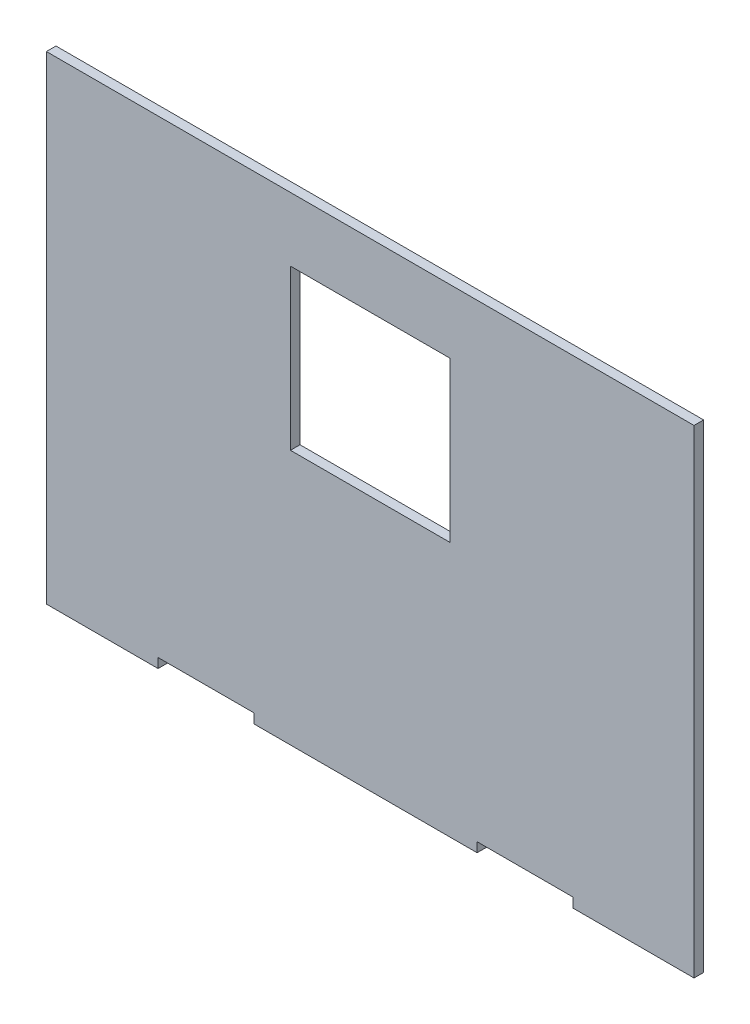
ISO-10303-21;
HEADER;
FILE_DESCRIPTION(('STEP AP214'),'2;1');
FILE_NAME('part.step','',(''),(''),'','','');
FILE_SCHEMA(('AUTOMOTIVE_DESIGN { 1 0 10303 214 1 1 1 1 }'));
ENDSEC;
DATA;
#1=APPLICATION_CONTEXT('core data for automotive mechanical design processes');
#2=APPLICATION_PROTOCOL_DEFINITION('international standard','automotive_design',2000,#1);
#3=PRODUCT_CONTEXT('',#1,'mechanical');
#4=PRODUCT('Part','Part','',(#3));
#5=PRODUCT_RELATED_PRODUCT_CATEGORY('part','',(#4));
#6=PRODUCT_DEFINITION_FORMATION('','',#4);
#7=PRODUCT_DEFINITION_CONTEXT('part definition',#1,'design');
#8=PRODUCT_DEFINITION('design','',#6,#7);
#9=PRODUCT_DEFINITION_SHAPE('','',#8);
#10=(LENGTH_UNIT() NAMED_UNIT(*) SI_UNIT(.MILLI.,.METRE.));
#11=(NAMED_UNIT(*) PLANE_ANGLE_UNIT() SI_UNIT($,.RADIAN.));
#12=(NAMED_UNIT(*) SI_UNIT($,.STERADIAN.) SOLID_ANGLE_UNIT());
#13=UNCERTAINTY_MEASURE_WITH_UNIT(LENGTH_MEASURE(1.E-05),#10,'distance_accuracy_value','');
#14=(GEOMETRIC_REPRESENTATION_CONTEXT(3) GLOBAL_UNCERTAINTY_ASSIGNED_CONTEXT((#13)) GLOBAL_UNIT_ASSIGNED_CONTEXT((#10,
#11,#12)) REPRESENTATION_CONTEXT('',''));
#15=CARTESIAN_POINT('',(0.,0.,0.));
#16=DIRECTION('',(0.,0.,1.));
#17=DIRECTION('',(1.,0.,0.));
#18=AXIS2_PLACEMENT_3D('',#15,#16,#17);
#19=CARTESIAN_POINT('',(-101.5,-75.,3.));
#20=DIRECTION('',(0.,1.,0.));
#21=DIRECTION('',(0.,0.,1.));
#22=AXIS2_PLACEMENT_3D('',#19,#20,#21);
#23=PLANE('',#22);
#24=DIRECTION('',(1.,0.,0.));
#25=VECTOR('',#24,1.);
#26=CARTESIAN_POINT('',(-101.5,-75.,0.));
#27=LINE('',#26,#25);
#28=CARTESIAN_POINT('',(-101.5,-75.,0.));
#29=VERTEX_POINT('',#28);
#30=CARTESIAN_POINT('',(-66.5000000000002,-75.,0.));
#31=VERTEX_POINT('',#30);
#32=EDGE_CURVE('E171',#29,#31,#27,.T.);
#33=ORIENTED_EDGE('',*,*,#32,.T.);
#34=DIRECTION('',(0.,0.,1.));
#35=VECTOR('',#34,1.);
#36=CARTESIAN_POINT('',(-66.5000000000002,-75.,-7.));
#37=LINE('',#36,#35);
#38=CARTESIAN_POINT('',(-66.5000000000002,-75.,3.));
#39=VERTEX_POINT('',#38);
#40=EDGE_CURVE('E154',#31,#39,#37,.T.);
#41=ORIENTED_EDGE('',*,*,#40,.T.);
#42=DIRECTION('',(1.,0.,0.));
#43=VECTOR('',#42,1.);
#44=CARTESIAN_POINT('',(-101.5,-75.,3.));
#45=LINE('',#44,#43);
#46=CARTESIAN_POINT('',(-101.5,-75.,3.));
#47=VERTEX_POINT('',#46);
#48=EDGE_CURVE('E169',#47,#39,#45,.T.);
#49=ORIENTED_EDGE('',*,*,#48,.F.);
#50=DIRECTION('',(0.,0.,-1.));
#51=VECTOR('',#50,1.);
#52=CARTESIAN_POINT('',(-101.5,-75.,3.));
#53=LINE('',#52,#51);
#54=EDGE_CURVE('E189',#47,#29,#53,.T.);
#55=ORIENTED_EDGE('',*,*,#54,.T.);
#56=EDGE_LOOP('',(#33,#41,#49,#55));
#57=FACE_BOUND('',#56,.T.);
#58=ADVANCED_FACE('F38',(#57),#23,.F.);
#59=CARTESIAN_POINT('',(-36.5000000000002,-75.,3.));
#60=VERTEX_POINT('',#59);
#61=CARTESIAN_POINT('',(33.4999999999998,-75.,3.));
#62=VERTEX_POINT('',#61);
#63=EDGE_CURVE('E183',#60,#62,#45,.T.);
#64=ORIENTED_EDGE('',*,*,#63,.F.);
#65=DIRECTION('',(0.,0.,1.));
#66=VECTOR('',#65,1.);
#67=CARTESIAN_POINT('',(-36.5000000000002,-75.,-7.));
#68=LINE('',#67,#66);
#69=CARTESIAN_POINT('',(-36.5000000000002,-75.,0.));
#70=VERTEX_POINT('',#69);
#71=EDGE_CURVE('E173',#70,#60,#68,.T.);
#72=ORIENTED_EDGE('',*,*,#71,.F.);
#73=CARTESIAN_POINT('',(33.4999999999998,-75.,0.));
#74=VERTEX_POINT('',#73);
#75=EDGE_CURVE('E281',#70,#74,#27,.T.);
#76=ORIENTED_EDGE('',*,*,#75,.T.);
#77=DIRECTION('',(0.,0.,1.));
#78=VECTOR('',#77,1.);
#79=CARTESIAN_POINT('',(33.4999999999998,-75.,-7.));
#80=LINE('',#79,#78);
#81=EDGE_CURVE('E163',#74,#62,#80,.T.);
#82=ORIENTED_EDGE('',*,*,#81,.T.);
#83=EDGE_LOOP('',(#64,#72,#76,#82));
#84=FACE_BOUND('',#83,.T.);
#85=ADVANCED_FACE('F353',(#84),#23,.F.);
#86=CARTESIAN_POINT('',(101.5,75.,3.));
#87=DIRECTION('',(-1.,0.,0.));
#88=DIRECTION('',(0.,-1.,0.));
#89=AXIS2_PLACEMENT_3D('',#86,#87,#88);
#90=PLANE('',#89);
#91=DIRECTION('',(0.,1.,0.));
#92=VECTOR('',#91,1.);
#93=CARTESIAN_POINT('',(101.5,75.,0.));
#94=LINE('',#93,#92);
#95=CARTESIAN_POINT('',(101.5,-75.,0.));
#96=VERTEX_POINT('',#95);
#97=CARTESIAN_POINT('',(101.5,75.,0.));
#98=VERTEX_POINT('',#97);
#99=EDGE_CURVE('E221',#96,#98,#94,.T.);
#100=ORIENTED_EDGE('',*,*,#99,.T.);
#101=DIRECTION('',(0.,0.,-1.));
#102=VECTOR('',#101,1.);
#103=CARTESIAN_POINT('',(101.5,75.,3.));
#104=LINE('',#103,#102);
#105=CARTESIAN_POINT('',(101.5,75.,3.));
#106=VERTEX_POINT('',#105);
#107=EDGE_CURVE('E312',#106,#98,#104,.T.);
#108=ORIENTED_EDGE('',*,*,#107,.F.);
#109=DIRECTION('',(0.,1.,0.));
#110=VECTOR('',#109,1.);
#111=CARTESIAN_POINT('',(101.5,75.,3.));
#112=LINE('',#111,#110);
#113=CARTESIAN_POINT('',(101.5,-75.,3.));
#114=VERTEX_POINT('',#113);
#115=EDGE_CURVE('E202',#114,#106,#112,.T.);
#116=ORIENTED_EDGE('',*,*,#115,.F.);
#117=DIRECTION('',(0.,0.,-1.));
#118=VECTOR('',#117,1.);
#119=CARTESIAN_POINT('',(101.5,-75.,3.));
#120=LINE('',#119,#118);
#121=EDGE_CURVE('E182',#114,#96,#120,.T.);
#122=ORIENTED_EDGE('',*,*,#121,.T.);
#123=EDGE_LOOP('',(#100,#108,#116,#122));
#124=FACE_BOUND('',#123,.T.);
#125=ADVANCED_FACE('F40',(#124),#90,.F.);
#126=CARTESIAN_POINT('',(-101.5,75.,3.));
#127=DIRECTION('',(0.,-1.,0.));
#128=DIRECTION('',(0.,0.,-1.));
#129=AXIS2_PLACEMENT_3D('',#126,#127,#128);
#130=PLANE('',#129);
#131=DIRECTION('',(-1.,0.,0.));
#132=VECTOR('',#131,1.);
#133=CARTESIAN_POINT('',(-101.5,75.,0.));
#134=LINE('',#133,#132);
#135=CARTESIAN_POINT('',(-101.5,75.,0.));
#136=VERTEX_POINT('',#135);
#137=EDGE_CURVE('E328',#98,#136,#134,.T.);
#138=ORIENTED_EDGE('',*,*,#137,.T.);
#139=DIRECTION('',(0.,0.,-1.));
#140=VECTOR('',#139,1.);
#141=CARTESIAN_POINT('',(-101.5,75.,3.));
#142=LINE('',#141,#140);
#143=CARTESIAN_POINT('',(-101.5,75.,3.));
#144=VERTEX_POINT('',#143);
#145=EDGE_CURVE('E316',#144,#136,#142,.T.);
#146=ORIENTED_EDGE('',*,*,#145,.F.);
#147=DIRECTION('',(-1.,0.,0.));
#148=VECTOR('',#147,1.);
#149=CARTESIAN_POINT('',(-101.5,75.,3.));
#150=LINE('',#149,#148);
#151=EDGE_CURVE('E200',#106,#144,#150,.T.);
#152=ORIENTED_EDGE('',*,*,#151,.F.);
#153=ORIENTED_EDGE('',*,*,#107,.T.);
#154=EDGE_LOOP('',(#138,#146,#152,#153));
#155=FACE_BOUND('',#154,.T.);
#156=ADVANCED_FACE('F340',(#155),#130,.F.);
#157=CARTESIAN_POINT('',(-101.5,75.,3.));
#158=DIRECTION('',(1.,0.,0.));
#159=DIRECTION('',(0.,1.,0.));
#160=AXIS2_PLACEMENT_3D('',#157,#158,#159);
#161=PLANE('',#160);
#162=DIRECTION('',(0.,-1.,0.));
#163=VECTOR('',#162,1.);
#164=CARTESIAN_POINT('',(-101.5,75.,0.));
#165=LINE('',#164,#163);
#166=EDGE_CURVE('E325',#136,#29,#165,.T.);
#167=ORIENTED_EDGE('',*,*,#166,.T.);
#168=ORIENTED_EDGE('',*,*,#54,.F.);
#169=DIRECTION('',(0.,-1.,0.));
#170=VECTOR('',#169,1.);
#171=CARTESIAN_POINT('',(-101.5,75.,3.));
#172=LINE('',#171,#170);
#173=EDGE_CURVE('E179',#144,#47,#172,.T.);
#174=ORIENTED_EDGE('',*,*,#173,.F.);
#175=ORIENTED_EDGE('',*,*,#145,.T.);
#176=EDGE_LOOP('',(#167,#168,#174,#175));
#177=FACE_BOUND('',#176,.T.);
#178=ADVANCED_FACE('F342',(#177),#161,.F.);
#179=CARTESIAN_POINT('',(63.4999999999998,-75.,3.));
#180=VERTEX_POINT('',#179);
#181=EDGE_CURVE('E185',#180,#114,#45,.T.);
#182=ORIENTED_EDGE('',*,*,#181,.F.);
#183=DIRECTION('',(0.,0.,1.));
#184=VECTOR('',#183,1.);
#185=CARTESIAN_POINT('',(63.4999999999998,-75.,-7.));
#186=LINE('',#185,#184);
#187=CARTESIAN_POINT('',(63.4999999999998,-75.,0.));
#188=VERTEX_POINT('',#187);
#189=EDGE_CURVE('E236',#188,#180,#186,.T.);
#190=ORIENTED_EDGE('',*,*,#189,.F.);
#191=EDGE_CURVE('E324',#188,#96,#27,.T.);
#192=ORIENTED_EDGE('',*,*,#191,.T.);
#193=ORIENTED_EDGE('',*,*,#121,.F.);
#194=EDGE_LOOP('',(#182,#190,#192,#193));
#195=FACE_BOUND('',#194,.T.);
#196=ADVANCED_FACE('F344',(#195),#23,.F.);
#197=CARTESIAN_POINT('',(0.,0.,3.));
#198=DIRECTION('',(0.,0.,1.));
#199=DIRECTION('',(1.,0.,0.));
#200=AXIS2_PLACEMENT_3D('',#197,#198,#199);
#201=PLANE('',#200);
#202=DIRECTION('',(0.,-1.,0.));
#203=VECTOR('',#202,1.);
#204=CARTESIAN_POINT('',(-66.5000000000002,-75.,3.));
#205=LINE('',#204,#203);
#206=CARTESIAN_POINT('',(-66.5000000000002,-72.,3.));
#207=VERTEX_POINT('',#206);
#208=EDGE_CURVE('E151',#207,#39,#205,.T.);
#209=ORIENTED_EDGE('',*,*,#208,.F.);
#210=DIRECTION('',(-1.,0.,0.));
#211=VECTOR('',#210,1.);
#212=CARTESIAN_POINT('',(-66.5000000000002,-72.,3.));
#213=LINE('',#212,#211);
#214=CARTESIAN_POINT('',(-36.5000000000002,-72.,3.));
#215=VERTEX_POINT('',#214);
#216=EDGE_CURVE('E174',#215,#207,#213,.T.);
#217=ORIENTED_EDGE('',*,*,#216,.F.);
#218=DIRECTION('',(0.,1.,0.));
#219=VECTOR('',#218,1.);
#220=CARTESIAN_POINT('',(-36.5000000000002,-75.,3.));
#221=LINE('',#220,#219);
#222=EDGE_CURVE('E162',#60,#215,#221,.T.);
#223=ORIENTED_EDGE('',*,*,#222,.F.);
#224=ORIENTED_EDGE('',*,*,#63,.T.);
#225=DIRECTION('',(0.,-1.,0.));
#226=VECTOR('',#225,1.);
#227=CARTESIAN_POINT('',(33.4999999999998,-75.,3.));
#228=LINE('',#227,#226);
#229=CARTESIAN_POINT('',(33.4999999999998,-72.,3.));
#230=VERTEX_POINT('',#229);
#231=EDGE_CURVE('E239',#230,#62,#228,.T.);
#232=ORIENTED_EDGE('',*,*,#231,.F.);
#233=DIRECTION('',(-1.,0.,0.));
#234=VECTOR('',#233,1.);
#235=CARTESIAN_POINT('',(33.4999999999998,-72.,3.));
#236=LINE('',#235,#234);
#237=CARTESIAN_POINT('',(63.4999999999998,-72.,3.));
#238=VERTEX_POINT('',#237);
#239=EDGE_CURVE('E250',#238,#230,#236,.T.);
#240=ORIENTED_EDGE('',*,*,#239,.F.);
#241=DIRECTION('',(0.,1.,0.));
#242=VECTOR('',#241,1.);
#243=CARTESIAN_POINT('',(63.4999999999998,-75.,3.));
#244=LINE('',#243,#242);
#245=EDGE_CURVE('E254',#180,#238,#244,.T.);
#246=ORIENTED_EDGE('',*,*,#245,.F.);
#247=ORIENTED_EDGE('',*,*,#181,.T.);
#248=ORIENTED_EDGE('',*,*,#115,.T.);
#249=ORIENTED_EDGE('',*,*,#151,.T.);
#250=ORIENTED_EDGE('',*,*,#173,.T.);
#251=ORIENTED_EDGE('',*,*,#48,.T.);
#252=EDGE_LOOP('',(#209,#217,#223,#224,#232,#240,#246,#247,#248,#249,#250,#251));
#253=FACE_BOUND('',#252,.T.);
#254=DIRECTION('',(0.,1.,0.));
#255=VECTOR('',#254,1.);
#256=CARTESIAN_POINT('',(25.,55.,3.));
#257=LINE('',#256,#255);
#258=CARTESIAN_POINT('',(25.,5.,3.));
#259=VERTEX_POINT('',#258);
#260=CARTESIAN_POINT('',(25.,55.,3.));
#261=VERTEX_POINT('',#260);
#262=EDGE_CURVE('E233',#259,#261,#257,.T.);
#263=ORIENTED_EDGE('',*,*,#262,.F.);
#264=DIRECTION('',(1.,0.,0.));
#265=VECTOR('',#264,1.);
#266=CARTESIAN_POINT('',(-25.,5.,3.));
#267=LINE('',#266,#265);
#268=CARTESIAN_POINT('',(-25.,5.,3.));
#269=VERTEX_POINT('',#268);
#270=EDGE_CURVE('E212',#269,#259,#267,.T.);
#271=ORIENTED_EDGE('',*,*,#270,.F.);
#272=DIRECTION('',(0.,-1.,0.));
#273=VECTOR('',#272,1.);
#274=CARTESIAN_POINT('',(-25.,55.,3.));
#275=LINE('',#274,#273);
#276=CARTESIAN_POINT('',(-25.,55.,3.));
#277=VERTEX_POINT('',#276);
#278=EDGE_CURVE('E225',#277,#269,#275,.T.);
#279=ORIENTED_EDGE('',*,*,#278,.F.);
#280=DIRECTION('',(-1.,0.,0.));
#281=VECTOR('',#280,1.);
#282=CARTESIAN_POINT('',(-25.,55.,3.));
#283=LINE('',#282,#281);
#284=EDGE_CURVE('E229',#261,#277,#283,.T.);
#285=ORIENTED_EDGE('',*,*,#284,.F.);
#286=EDGE_LOOP('',(#263,#271,#279,#285));
#287=FACE_BOUND('',#286,.T.);
#288=ADVANCED_FACE('F176',(#253,#287),#201,.T.);
#289=CARTESIAN_POINT('',(0.,0.,0.));
#290=DIRECTION('',(0.,0.,1.));
#291=DIRECTION('',(1.,0.,0.));
#292=AXIS2_PLACEMENT_3D('',#289,#290,#291);
#293=PLANE('',#292);
#294=DIRECTION('',(1.,0.,0.));
#295=VECTOR('',#294,1.);
#296=CARTESIAN_POINT('',(0.,5.,0.));
#297=LINE('',#296,#295);
#298=CARTESIAN_POINT('',(-25.,5.,0.));
#299=VERTEX_POINT('',#298);
#300=CARTESIAN_POINT('',(25.,5.,0.));
#301=VERTEX_POINT('',#300);
#302=EDGE_CURVE('E300',#299,#301,#297,.T.);
#303=ORIENTED_EDGE('',*,*,#302,.T.);
#304=DIRECTION('',(0.,1.,0.));
#305=VECTOR('',#304,1.);
#306=CARTESIAN_POINT('',(25.,0.,0.));
#307=LINE('',#306,#305);
#308=CARTESIAN_POINT('',(25.,55.,0.));
#309=VERTEX_POINT('',#308);
#310=EDGE_CURVE('E296',#301,#309,#307,.T.);
#311=ORIENTED_EDGE('',*,*,#310,.T.);
#312=DIRECTION('',(-1.,0.,0.));
#313=VECTOR('',#312,1.);
#314=CARTESIAN_POINT('',(0.,55.,0.));
#315=LINE('',#314,#313);
#316=CARTESIAN_POINT('',(-25.,55.,0.));
#317=VERTEX_POINT('',#316);
#318=EDGE_CURVE('E308',#309,#317,#315,.T.);
#319=ORIENTED_EDGE('',*,*,#318,.T.);
#320=DIRECTION('',(0.,-1.,0.));
#321=VECTOR('',#320,1.);
#322=CARTESIAN_POINT('',(-25.,0.,0.));
#323=LINE('',#322,#321);
#324=EDGE_CURVE('E304',#317,#299,#323,.T.);
#325=ORIENTED_EDGE('',*,*,#324,.T.);
#326=EDGE_LOOP('',(#303,#311,#319,#325));
#327=FACE_BOUND('',#326,.T.);
#328=DIRECTION('',(-1.,0.,0.));
#329=VECTOR('',#328,1.);
#330=CARTESIAN_POINT('',(0.,-72.,0.));
#331=LINE('',#330,#329);
#332=CARTESIAN_POINT('',(-36.5000000000002,-72.,0.));
#333=VERTEX_POINT('',#332);
#334=CARTESIAN_POINT('',(-66.5000000000002,-72.,0.));
#335=VERTEX_POINT('',#334);
#336=EDGE_CURVE('E47',#333,#335,#331,.T.);
#337=ORIENTED_EDGE('',*,*,#336,.T.);
#338=DIRECTION('',(0.,-1.,0.));
#339=VECTOR('',#338,1.);
#340=CARTESIAN_POINT('',(-66.5000000000002,0.,0.));
#341=LINE('',#340,#339);
#342=EDGE_CURVE('E11',#335,#31,#341,.T.);
#343=ORIENTED_EDGE('',*,*,#342,.T.);
#344=ORIENTED_EDGE('',*,*,#32,.F.);
#345=ORIENTED_EDGE('',*,*,#166,.F.);
#346=ORIENTED_EDGE('',*,*,#137,.F.);
#347=ORIENTED_EDGE('',*,*,#99,.F.);
#348=ORIENTED_EDGE('',*,*,#191,.F.);
#349=DIRECTION('',(0.,1.,0.));
#350=VECTOR('',#349,1.);
#351=CARTESIAN_POINT('',(63.4999999999998,0.,0.));
#352=LINE('',#351,#350);
#353=CARTESIAN_POINT('',(63.4999999999998,-72.,0.));
#354=VERTEX_POINT('',#353);
#355=EDGE_CURVE('E292',#188,#354,#352,.T.);
#356=ORIENTED_EDGE('',*,*,#355,.T.);
#357=DIRECTION('',(-1.,0.,0.));
#358=VECTOR('',#357,1.);
#359=CARTESIAN_POINT('',(0.,-72.,0.));
#360=LINE('',#359,#358);
#361=CARTESIAN_POINT('',(33.4999999999998,-72.,0.));
#362=VERTEX_POINT('',#361);
#363=EDGE_CURVE('E286',#354,#362,#360,.T.);
#364=ORIENTED_EDGE('',*,*,#363,.T.);
#365=DIRECTION('',(0.,-1.,0.));
#366=VECTOR('',#365,1.);
#367=CARTESIAN_POINT('',(33.4999999999998,0.,0.));
#368=LINE('',#367,#366);
#369=EDGE_CURVE('E283',#362,#74,#368,.T.);
#370=ORIENTED_EDGE('',*,*,#369,.T.);
#371=ORIENTED_EDGE('',*,*,#75,.F.);
#372=DIRECTION('',(0.,1.,0.));
#373=VECTOR('',#372,1.);
#374=CARTESIAN_POINT('',(-36.5000000000002,0.,0.));
#375=LINE('',#374,#373);
#376=EDGE_CURVE('E276',#70,#333,#375,.T.);
#377=ORIENTED_EDGE('',*,*,#376,.T.);
#378=EDGE_LOOP('',(#337,#343,#344,#345,#346,#347,#348,#356,#364,#370,#371,#377));
#379=FACE_BOUND('',#378,.T.);
#380=ADVANCED_FACE('F278',(#327,#379),#293,.F.);
#381=CARTESIAN_POINT('',(25.,55.,-7.));
#382=DIRECTION('',(1.,0.,0.));
#383=DIRECTION('',(0.,1.,0.));
#384=AXIS2_PLACEMENT_3D('',#381,#382,#383);
#385=PLANE('',#384);
#386=DIRECTION('',(0.,0.,1.));
#387=VECTOR('',#386,1.);
#388=CARTESIAN_POINT('',(25.,5.,-7.));
#389=LINE('',#388,#387);
#390=EDGE_CURVE('E218',#301,#259,#389,.T.);
#391=ORIENTED_EDGE('',*,*,#390,.T.);
#392=ORIENTED_EDGE('',*,*,#262,.T.);
#393=DIRECTION('',(0.,0.,1.));
#394=VECTOR('',#393,1.);
#395=CARTESIAN_POINT('',(25.,55.,-7.));
#396=LINE('',#395,#394);
#397=EDGE_CURVE('E207',#309,#261,#396,.T.);
#398=ORIENTED_EDGE('',*,*,#397,.F.);
#399=ORIENTED_EDGE('',*,*,#310,.F.);
#400=EDGE_LOOP('',(#391,#392,#398,#399));
#401=FACE_BOUND('',#400,.T.);
#402=ADVANCED_FACE('F363',(#401),#385,.F.);
#403=CARTESIAN_POINT('',(-25.,5.,-7.));
#404=DIRECTION('',(0.,-1.,0.));
#405=DIRECTION('',(0.,0.,-1.));
#406=AXIS2_PLACEMENT_3D('',#403,#404,#405);
#407=PLANE('',#406);
#408=DIRECTION('',(0.,0.,1.));
#409=VECTOR('',#408,1.);
#410=CARTESIAN_POINT('',(-25.,5.,-7.));
#411=LINE('',#410,#409);
#412=EDGE_CURVE('E215',#299,#269,#411,.T.);
#413=ORIENTED_EDGE('',*,*,#412,.T.);
#414=ORIENTED_EDGE('',*,*,#270,.T.);
#415=ORIENTED_EDGE('',*,*,#390,.F.);
#416=ORIENTED_EDGE('',*,*,#302,.F.);
#417=EDGE_LOOP('',(#413,#414,#415,#416));
#418=FACE_BOUND('',#417,.T.);
#419=ADVANCED_FACE('F369',(#418),#407,.F.);
#420=CARTESIAN_POINT('',(-25.,55.,-7.));
#421=DIRECTION('',(-1.,0.,0.));
#422=DIRECTION('',(0.,-1.,0.));
#423=AXIS2_PLACEMENT_3D('',#420,#421,#422);
#424=PLANE('',#423);
#425=DIRECTION('',(0.,0.,1.));
#426=VECTOR('',#425,1.);
#427=CARTESIAN_POINT('',(-25.,55.,-7.));
#428=LINE('',#427,#426);
#429=EDGE_CURVE('E211',#317,#277,#428,.T.);
#430=ORIENTED_EDGE('',*,*,#429,.T.);
#431=ORIENTED_EDGE('',*,*,#278,.T.);
#432=ORIENTED_EDGE('',*,*,#412,.F.);
#433=ORIENTED_EDGE('',*,*,#324,.F.);
#434=EDGE_LOOP('',(#430,#431,#432,#433));
#435=FACE_BOUND('',#434,.T.);
#436=ADVANCED_FACE('F375',(#435),#424,.F.);
#437=CARTESIAN_POINT('',(-25.,55.,-7.));
#438=DIRECTION('',(0.,1.,0.));
#439=DIRECTION('',(0.,0.,1.));
#440=AXIS2_PLACEMENT_3D('',#437,#438,#439);
#441=PLANE('',#440);
#442=ORIENTED_EDGE('',*,*,#397,.T.);
#443=ORIENTED_EDGE('',*,*,#284,.T.);
#444=ORIENTED_EDGE('',*,*,#429,.F.);
#445=ORIENTED_EDGE('',*,*,#318,.F.);
#446=EDGE_LOOP('',(#442,#443,#444,#445));
#447=FACE_BOUND('',#446,.T.);
#448=ADVANCED_FACE('F371',(#447),#441,.F.);
#449=CARTESIAN_POINT('',(33.4999999999998,-75.,-7.));
#450=DIRECTION('',(-1.,0.,0.));
#451=DIRECTION('',(0.,0.,1.));
#452=AXIS2_PLACEMENT_3D('',#449,#450,#451);
#453=PLANE('',#452);
#454=DIRECTION('',(0.,0.,1.));
#455=VECTOR('',#454,1.);
#456=CARTESIAN_POINT('',(33.4999999999998,-72.,-7.));
#457=LINE('',#456,#455);
#458=EDGE_CURVE('E242',#362,#230,#457,.T.);
#459=ORIENTED_EDGE('',*,*,#458,.T.);
#460=ORIENTED_EDGE('',*,*,#231,.T.);
#461=ORIENTED_EDGE('',*,*,#81,.F.);
#462=ORIENTED_EDGE('',*,*,#369,.F.);
#463=EDGE_LOOP('',(#459,#460,#461,#462));
#464=FACE_BOUND('',#463,.T.);
#465=ADVANCED_FACE('F374',(#464),#453,.F.);
#466=CARTESIAN_POINT('',(33.4999999999998,-72.,-7.));
#467=DIRECTION('',(0.,1.,0.));
#468=DIRECTION('',(0.,0.,1.));
#469=AXIS2_PLACEMENT_3D('',#466,#467,#468);
#470=PLANE('',#469);
#471=DIRECTION('',(0.,0.,1.));
#472=VECTOR('',#471,1.);
#473=CARTESIAN_POINT('',(63.4999999999998,-72.,-7.));
#474=LINE('',#473,#472);
#475=EDGE_CURVE('E62',#354,#238,#474,.T.);
#476=ORIENTED_EDGE('',*,*,#475,.T.);
#477=ORIENTED_EDGE('',*,*,#239,.T.);
#478=ORIENTED_EDGE('',*,*,#458,.F.);
#479=ORIENTED_EDGE('',*,*,#363,.F.);
#480=EDGE_LOOP('',(#476,#477,#478,#479));
#481=FACE_BOUND('',#480,.T.);
#482=ADVANCED_FACE('F386',(#481),#470,.F.);
#483=CARTESIAN_POINT('',(63.4999999999998,-75.,-7.));
#484=DIRECTION('',(1.,0.,0.));
#485=DIRECTION('',(0.,0.,-1.));
#486=AXIS2_PLACEMENT_3D('',#483,#484,#485);
#487=PLANE('',#486);
#488=ORIENTED_EDGE('',*,*,#189,.T.);
#489=ORIENTED_EDGE('',*,*,#245,.T.);
#490=ORIENTED_EDGE('',*,*,#475,.F.);
#491=ORIENTED_EDGE('',*,*,#355,.F.);
#492=EDGE_LOOP('',(#488,#489,#490,#491));
#493=FACE_BOUND('',#492,.T.);
#494=ADVANCED_FACE('F383',(#493),#487,.F.);
#495=CARTESIAN_POINT('',(-66.5000000000002,-75.,-7.));
#496=DIRECTION('',(-1.,0.,0.));
#497=DIRECTION('',(0.,0.,1.));
#498=AXIS2_PLACEMENT_3D('',#495,#496,#497);
#499=PLANE('',#498);
#500=DIRECTION('',(0.,0.,1.));
#501=VECTOR('',#500,1.);
#502=CARTESIAN_POINT('',(-66.5000000000002,-72.,-7.));
#503=LINE('',#502,#501);
#504=EDGE_CURVE('E156',#335,#207,#503,.T.);
#505=ORIENTED_EDGE('',*,*,#504,.T.);
#506=ORIENTED_EDGE('',*,*,#208,.T.);
#507=ORIENTED_EDGE('',*,*,#40,.F.);
#508=ORIENTED_EDGE('',*,*,#342,.F.);
#509=EDGE_LOOP('',(#505,#506,#507,#508));
#510=FACE_BOUND('',#509,.T.);
#511=ADVANCED_FACE('F153',(#510),#499,.F.);
#512=CARTESIAN_POINT('',(-66.5000000000002,-72.,-7.));
#513=DIRECTION('',(0.,1.,0.));
#514=DIRECTION('',(0.,0.,1.));
#515=AXIS2_PLACEMENT_3D('',#512,#513,#514);
#516=PLANE('',#515);
#517=DIRECTION('',(0.,0.,1.));
#518=VECTOR('',#517,1.);
#519=CARTESIAN_POINT('',(-36.5000000000002,-72.,-7.));
#520=LINE('',#519,#518);
#521=EDGE_CURVE('E54',#333,#215,#520,.T.);
#522=ORIENTED_EDGE('',*,*,#521,.T.);
#523=ORIENTED_EDGE('',*,*,#216,.T.);
#524=ORIENTED_EDGE('',*,*,#504,.F.);
#525=ORIENTED_EDGE('',*,*,#336,.F.);
#526=EDGE_LOOP('',(#522,#523,#524,#525));
#527=FACE_BOUND('',#526,.T.);
#528=ADVANCED_FACE('F271',(#527),#516,.F.);
#529=CARTESIAN_POINT('',(-36.5000000000002,-75.,-7.));
#530=DIRECTION('',(1.,0.,0.));
#531=DIRECTION('',(0.,0.,-1.));
#532=AXIS2_PLACEMENT_3D('',#529,#530,#531);
#533=PLANE('',#532);
#534=ORIENTED_EDGE('',*,*,#71,.T.);
#535=ORIENTED_EDGE('',*,*,#222,.T.);
#536=ORIENTED_EDGE('',*,*,#521,.F.);
#537=ORIENTED_EDGE('',*,*,#376,.F.);
#538=EDGE_LOOP('',(#534,#535,#536,#537));
#539=FACE_BOUND('',#538,.T.);
#540=ADVANCED_FACE('F267',(#539),#533,.F.);
#541=CLOSED_SHELL('',(#58,#85,#125,#156,#178,#196,#288,#380,#402,#419,#436,#448,#465,#482,#494,
#511,#528,#540));
#542=MANIFOLD_SOLID_BREP('B2',#541);
#543=ADVANCED_BREP_SHAPE_REPRESENTATION('',(#18,#542),#14);
#544=SHAPE_DEFINITION_REPRESENTATION(#9,#543);
ENDSEC;
END-ISO-10303-21;
